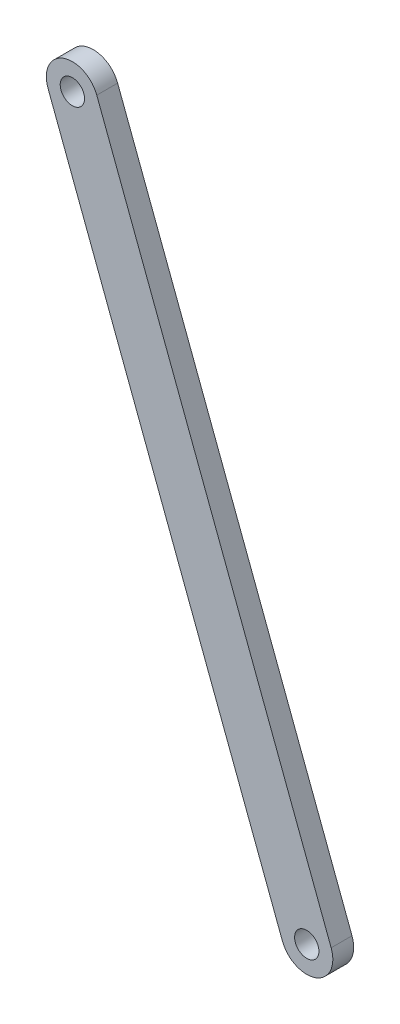
ISO-10303-21;
HEADER;
FILE_DESCRIPTION(('STEP AP214'),'2;1');
FILE_NAME('part.step','',(''),(''),'','','');
FILE_SCHEMA(('AUTOMOTIVE_DESIGN { 1 0 10303 214 1 1 1 1 }'));
ENDSEC;
DATA;
#1=APPLICATION_CONTEXT('core data for automotive mechanical design processes');
#2=APPLICATION_PROTOCOL_DEFINITION('international standard','automotive_design',2000,#1);
#3=PRODUCT_CONTEXT('',#1,'mechanical');
#4=PRODUCT('Part','Part','',(#3));
#5=PRODUCT_RELATED_PRODUCT_CATEGORY('part','',(#4));
#6=PRODUCT_DEFINITION_FORMATION('','',#4);
#7=PRODUCT_DEFINITION_CONTEXT('part definition',#1,'design');
#8=PRODUCT_DEFINITION('design','',#6,#7);
#9=PRODUCT_DEFINITION_SHAPE('','',#8);
#10=(LENGTH_UNIT() NAMED_UNIT(*) SI_UNIT(.MILLI.,.METRE.));
#11=(NAMED_UNIT(*) PLANE_ANGLE_UNIT() SI_UNIT($,.RADIAN.));
#12=(NAMED_UNIT(*) SI_UNIT($,.STERADIAN.) SOLID_ANGLE_UNIT());
#13=UNCERTAINTY_MEASURE_WITH_UNIT(LENGTH_MEASURE(1.E-05),#10,'distance_accuracy_value','');
#14=(GEOMETRIC_REPRESENTATION_CONTEXT(3) GLOBAL_UNCERTAINTY_ASSIGNED_CONTEXT((#13)) GLOBAL_UNIT_ASSIGNED_CONTEXT((#10,
#11,#12)) REPRESENTATION_CONTEXT('',''));
#15=CARTESIAN_POINT('',(0.,0.,0.));
#16=DIRECTION('',(0.,0.,1.));
#17=DIRECTION('',(1.,0.,0.));
#18=AXIS2_PLACEMENT_3D('',#15,#16,#17);
#19=CARTESIAN_POINT('',(-67.4254862550688,-79.1820926931558,6.));
#20=DIRECTION('',(0.,0.,1.));
#21=DIRECTION('',(1.,0.,0.));
#22=AXIS2_PLACEMENT_3D('',#19,#20,#21);
#23=PLANE('',#22);
#24=CARTESIAN_POINT('',(0.,-257.88520907132,6.));
#25=DIRECTION('',(0.,0.,1.));
#26=DIRECTION('',(1.,0.,0.));
#27=AXIS2_PLACEMENT_3D('',#24,#25,#26);
#28=CIRCLE('',#27,3.50000000000001);
#29=CARTESIAN_POINT('',(3.49999999999999,-257.88520907132,6.));
#30=VERTEX_POINT('',#29);
#31=EDGE_CURVE('E99',#30,#30,#28,.T.);
#32=ORIENTED_EDGE('',*,*,#31,.F.);
#33=EDGE_LOOP('',(#32));
#34=FACE_BOUND('',#33,.T.);
#35=CARTESIAN_POINT('',(-67.4254862550688,-79.1820926931558,6.));
#36=DIRECTION('',(0.,0.,1.));
#37=DIRECTION('',(1.,0.,0.));
#38=AXIS2_PLACEMENT_3D('',#35,#36,#37);
#39=CIRCLE('',#38,7.50000000000001);
#40=CARTESIAN_POINT('',(-60.4083481773922,-76.534495065339,6.));
#41=VERTEX_POINT('',#40);
#42=CARTESIAN_POINT('',(-74.4426243327454,-81.8296903209727,6.));
#43=VERTEX_POINT('',#42);
#44=EDGE_CURVE('E84',#41,#43,#39,.T.);
#45=ORIENTED_EDGE('',*,*,#44,.T.);
#46=DIRECTION('',(0.353013017042245,-0.935618410356878,0.));
#47=VECTOR('',#46,1.);
#48=CARTESIAN_POINT('',(-74.4426243327454,-81.8296903209727,6.));
#49=LINE('',#48,#47);
#50=CARTESIAN_POINT('',(-7.01713807767656,-260.532806699136,6.));
#51=VERTEX_POINT('',#50);
#52=EDGE_CURVE('E79',#43,#51,#49,.T.);
#53=ORIENTED_EDGE('',*,*,#52,.T.);
#54=CARTESIAN_POINT('',(0.,-257.88520907132,6.));
#55=DIRECTION('',(0.,0.,1.));
#56=DIRECTION('',(1.,0.,0.));
#57=AXIS2_PLACEMENT_3D('',#54,#55,#56);
#58=CIRCLE('',#57,7.49999999999997);
#59=CARTESIAN_POINT('',(7.01713807767655,-255.237611443503,6.));
#60=VERTEX_POINT('',#59);
#61=EDGE_CURVE('E82',#51,#60,#58,.T.);
#62=ORIENTED_EDGE('',*,*,#61,.T.);
#63=DIRECTION('',(-0.353013017042245,0.935618410356878,0.));
#64=VECTOR('',#63,1.);
#65=CARTESIAN_POINT('',(7.01713807767655,-255.237611443503,6.));
#66=LINE('',#65,#64);
#67=EDGE_CURVE('E49',#60,#41,#66,.T.);
#68=ORIENTED_EDGE('',*,*,#67,.T.);
#69=EDGE_LOOP('',(#45,#53,#62,#68));
#70=FACE_BOUND('',#69,.T.);
#71=CARTESIAN_POINT('',(-67.4254862550688,-79.1820926931558,6.));
#72=DIRECTION('',(0.,0.,1.));
#73=DIRECTION('',(1.,0.,0.));
#74=AXIS2_PLACEMENT_3D('',#71,#72,#73);
#75=CIRCLE('',#74,3.50000000000001);
#76=CARTESIAN_POINT('',(-63.9254862550688,-79.1820926931558,6.));
#77=VERTEX_POINT('',#76);
#78=EDGE_CURVE('E114',#77,#77,#75,.T.);
#79=ORIENTED_EDGE('',*,*,#78,.F.);
#80=EDGE_LOOP('',(#79));
#81=FACE_BOUND('',#80,.T.);
#82=ADVANCED_FACE('F32',(#34,#70,#81),#23,.T.);
#83=CARTESIAN_POINT('',(-67.4254862550688,-79.1820926931558,0.));
#84=DIRECTION('',(0.,0.,1.));
#85=DIRECTION('',(1.,0.,0.));
#86=AXIS2_PLACEMENT_3D('',#83,#84,#85);
#87=PLANE('',#86);
#88=CARTESIAN_POINT('',(-67.4254862550688,-79.1820926931558,0.));
#89=DIRECTION('',(0.,0.,1.));
#90=DIRECTION('',(1.,0.,0.));
#91=AXIS2_PLACEMENT_3D('',#88,#89,#90);
#92=CIRCLE('',#91,7.50000000000001);
#93=CARTESIAN_POINT('',(-60.4083481773922,-76.534495065339,0.));
#94=VERTEX_POINT('',#93);
#95=CARTESIAN_POINT('',(-74.4426243327454,-81.8296903209727,0.));
#96=VERTEX_POINT('',#95);
#97=EDGE_CURVE('E96',#94,#96,#92,.T.);
#98=ORIENTED_EDGE('',*,*,#97,.F.);
#99=DIRECTION('',(-0.353013017042245,0.935618410356878,0.));
#100=VECTOR('',#99,1.);
#101=CARTESIAN_POINT('',(7.01713807767655,-255.237611443503,0.));
#102=LINE('',#101,#100);
#103=CARTESIAN_POINT('',(7.01713807767655,-255.237611443503,0.));
#104=VERTEX_POINT('',#103);
#105=EDGE_CURVE('E72',#104,#94,#102,.T.);
#106=ORIENTED_EDGE('',*,*,#105,.F.);
#107=CARTESIAN_POINT('',(0.,-257.88520907132,0.));
#108=DIRECTION('',(0.,0.,1.));
#109=DIRECTION('',(1.,0.,0.));
#110=AXIS2_PLACEMENT_3D('',#107,#108,#109);
#111=CIRCLE('',#110,7.49999999999997);
#112=CARTESIAN_POINT('',(-7.01713807767656,-260.532806699136,0.));
#113=VERTEX_POINT('',#112);
#114=EDGE_CURVE('E66',#113,#104,#111,.T.);
#115=ORIENTED_EDGE('',*,*,#114,.F.);
#116=DIRECTION('',(0.353013017042245,-0.935618410356878,0.));
#117=VECTOR('',#116,1.);
#118=CARTESIAN_POINT('',(-74.4426243327454,-81.8296903209727,0.));
#119=LINE('',#118,#117);
#120=EDGE_CURVE('E88',#96,#113,#119,.T.);
#121=ORIENTED_EDGE('',*,*,#120,.F.);
#122=EDGE_LOOP('',(#98,#106,#115,#121));
#123=FACE_BOUND('',#122,.T.);
#124=CARTESIAN_POINT('',(0.,-257.88520907132,0.));
#125=DIRECTION('',(0.,0.,1.));
#126=DIRECTION('',(1.,0.,0.));
#127=AXIS2_PLACEMENT_3D('',#124,#125,#126);
#128=CIRCLE('',#127,3.50000000000001);
#129=CARTESIAN_POINT('',(3.49999999999999,-257.88520907132,0.));
#130=VERTEX_POINT('',#129);
#131=EDGE_CURVE('E111',#130,#130,#128,.T.);
#132=ORIENTED_EDGE('',*,*,#131,.T.);
#133=EDGE_LOOP('',(#132));
#134=FACE_BOUND('',#133,.T.);
#135=CARTESIAN_POINT('',(-67.4254862550688,-79.1820926931558,0.));
#136=DIRECTION('',(0.,0.,1.));
#137=DIRECTION('',(1.,0.,0.));
#138=AXIS2_PLACEMENT_3D('',#135,#136,#137);
#139=CIRCLE('',#138,3.50000000000001);
#140=CARTESIAN_POINT('',(-63.9254862550688,-79.1820926931558,0.));
#141=VERTEX_POINT('',#140);
#142=EDGE_CURVE('E117',#141,#141,#139,.T.);
#143=ORIENTED_EDGE('',*,*,#142,.T.);
#144=EDGE_LOOP('',(#143));
#145=FACE_BOUND('',#144,.T.);
#146=ADVANCED_FACE('F107',(#123,#134,#145),#87,.F.);
#147=CARTESIAN_POINT('',(-67.4254862550688,-79.1820926931558,6.));
#148=DIRECTION('',(0.,0.,-1.));
#149=DIRECTION('',(-1.,0.,0.));
#150=AXIS2_PLACEMENT_3D('',#147,#148,#149);
#151=CYLINDRICAL_SURFACE('',#150,7.50000000000001);
#152=ORIENTED_EDGE('',*,*,#97,.T.);
#153=DIRECTION('',(0.,0.,-1.));
#154=VECTOR('',#153,1.);
#155=CARTESIAN_POINT('',(-74.4426243327454,-81.8296903209727,6.));
#156=LINE('',#155,#154);
#157=EDGE_CURVE('E11',#43,#96,#156,.T.);
#158=ORIENTED_EDGE('',*,*,#157,.F.);
#159=ORIENTED_EDGE('',*,*,#44,.F.);
#160=DIRECTION('',(0.,0.,-1.));
#161=VECTOR('',#160,1.);
#162=CARTESIAN_POINT('',(-60.4083481773922,-76.534495065339,6.));
#163=LINE('',#162,#161);
#164=EDGE_CURVE('E92',#41,#94,#163,.T.);
#165=ORIENTED_EDGE('',*,*,#164,.T.);
#166=EDGE_LOOP('',(#152,#158,#159,#165));
#167=FACE_BOUND('',#166,.T.);
#168=ADVANCED_FACE('F34',(#167),#151,.T.);
#169=CARTESIAN_POINT('',(-74.4426243327454,-81.8296903209727,6.));
#170=DIRECTION('',(0.935618410356878,0.353013017042245,0.));
#171=DIRECTION('',(-0.353013017042245,0.935618410356878,0.));
#172=AXIS2_PLACEMENT_3D('',#169,#170,#171);
#173=PLANE('',#172);
#174=ORIENTED_EDGE('',*,*,#120,.T.);
#175=DIRECTION('',(0.,0.,-1.));
#176=VECTOR('',#175,1.);
#177=CARTESIAN_POINT('',(-7.01713807767656,-260.532806699136,6.));
#178=LINE('',#177,#176);
#179=EDGE_CURVE('E41',#51,#113,#178,.T.);
#180=ORIENTED_EDGE('',*,*,#179,.F.);
#181=ORIENTED_EDGE('',*,*,#52,.F.);
#182=ORIENTED_EDGE('',*,*,#157,.T.);
#183=EDGE_LOOP('',(#174,#180,#181,#182));
#184=FACE_BOUND('',#183,.T.);
#185=ADVANCED_FACE('F87',(#184),#173,.F.);
#186=CARTESIAN_POINT('',(0.,-257.88520907132,6.));
#187=DIRECTION('',(0.,0.,-1.));
#188=DIRECTION('',(-1.,0.,0.));
#189=AXIS2_PLACEMENT_3D('',#186,#187,#188);
#190=CYLINDRICAL_SURFACE('',#189,7.49999999999997);
#191=ORIENTED_EDGE('',*,*,#114,.T.);
#192=DIRECTION('',(0.,0.,-1.));
#193=VECTOR('',#192,1.);
#194=CARTESIAN_POINT('',(7.01713807767655,-255.237611443503,6.));
#195=LINE('',#194,#193);
#196=EDGE_CURVE('E89',#60,#104,#195,.T.);
#197=ORIENTED_EDGE('',*,*,#196,.F.);
#198=ORIENTED_EDGE('',*,*,#61,.F.);
#199=ORIENTED_EDGE('',*,*,#179,.T.);
#200=EDGE_LOOP('',(#191,#197,#198,#199));
#201=FACE_BOUND('',#200,.T.);
#202=ADVANCED_FACE('F90',(#201),#190,.T.);
#203=CARTESIAN_POINT('',(7.01713807767655,-255.237611443503,6.));
#204=DIRECTION('',(-0.935618410356878,-0.353013017042245,0.));
#205=DIRECTION('',(0.353013017042245,-0.935618410356878,0.));
#206=AXIS2_PLACEMENT_3D('',#203,#204,#205);
#207=PLANE('',#206);
#208=ORIENTED_EDGE('',*,*,#105,.T.);
#209=ORIENTED_EDGE('',*,*,#164,.F.);
#210=ORIENTED_EDGE('',*,*,#67,.F.);
#211=ORIENTED_EDGE('',*,*,#196,.T.);
#212=EDGE_LOOP('',(#208,#209,#210,#211));
#213=FACE_BOUND('',#212,.T.);
#214=ADVANCED_FACE('F104',(#213),#207,.F.);
#215=CARTESIAN_POINT('',(0.,-257.88520907132,6.));
#216=DIRECTION('',(0.,0.,-1.));
#217=DIRECTION('',(-1.,0.,0.));
#218=AXIS2_PLACEMENT_3D('',#215,#216,#217);
#219=CYLINDRICAL_SURFACE('',#218,3.50000000000001);
#220=ORIENTED_EDGE('',*,*,#31,.T.);
#221=EDGE_LOOP('',(#220));
#222=FACE_BOUND('',#221,.T.);
#223=ORIENTED_EDGE('',*,*,#131,.F.);
#224=EDGE_LOOP('',(#223));
#225=FACE_BOUND('',#224,.T.);
#226=ADVANCED_FACE('F134',(#222,#225),#219,.F.);
#227=CARTESIAN_POINT('',(-67.4254862550688,-79.1820926931558,6.));
#228=DIRECTION('',(0.,0.,-1.));
#229=DIRECTION('',(-1.,0.,0.));
#230=AXIS2_PLACEMENT_3D('',#227,#228,#229);
#231=CYLINDRICAL_SURFACE('',#230,3.50000000000001);
#232=ORIENTED_EDGE('',*,*,#78,.T.);
#233=EDGE_LOOP('',(#232));
#234=FACE_BOUND('',#233,.T.);
#235=ORIENTED_EDGE('',*,*,#142,.F.);
#236=EDGE_LOOP('',(#235));
#237=FACE_BOUND('',#236,.T.);
#238=ADVANCED_FACE('F123',(#234,#237),#231,.F.);
#239=CLOSED_SHELL('',(#82,#146,#168,#185,#202,#214,#226,#238));
#240=MANIFOLD_SOLID_BREP('B2',#239);
#241=ADVANCED_BREP_SHAPE_REPRESENTATION('',(#18,#240),#14);
#242=SHAPE_DEFINITION_REPRESENTATION(#9,#241);
ENDSEC;
END-ISO-10303-21;
